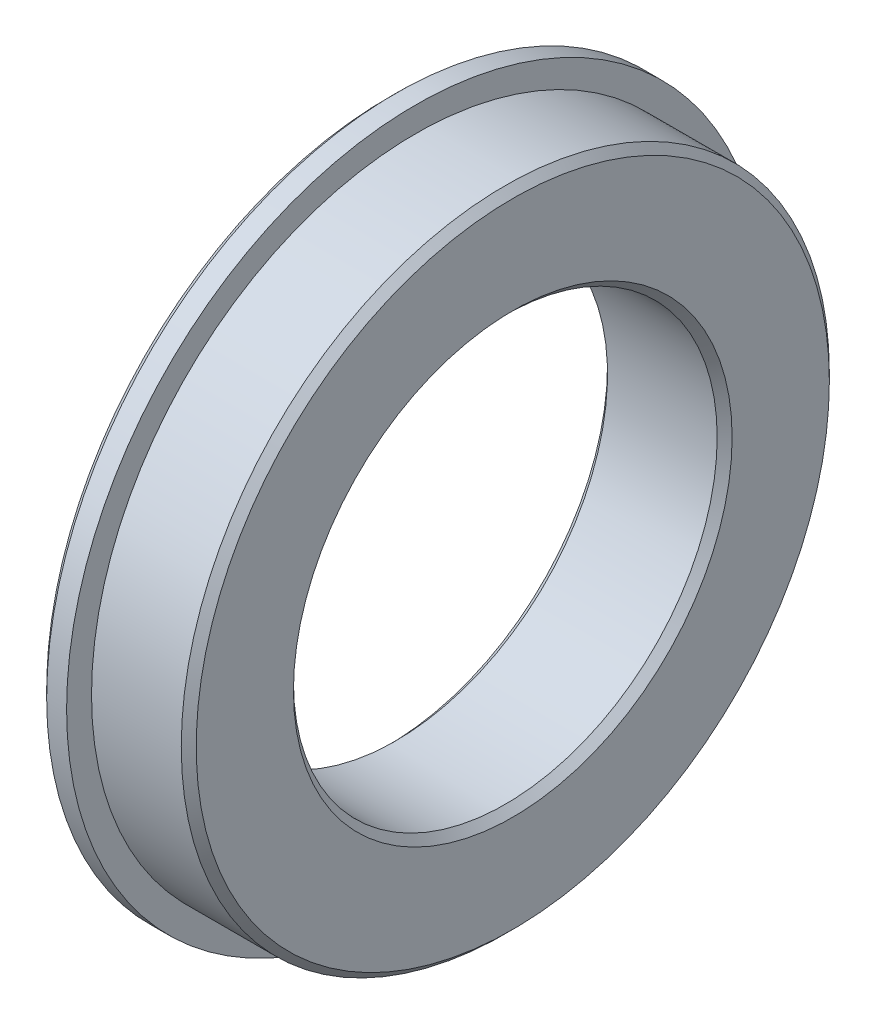
ISO-10303-21;
HEADER;
FILE_DESCRIPTION(('STEP AP214'),'2;1');
FILE_NAME('part.step','',(''),(''),'','','');
FILE_SCHEMA(('AUTOMOTIVE_DESIGN { 1 0 10303 214 1 1 1 1 }'));
ENDSEC;
DATA;
#1=APPLICATION_CONTEXT('core data for automotive mechanical design processes');
#2=APPLICATION_PROTOCOL_DEFINITION('international standard','automotive_design',2000,#1);
#3=PRODUCT_CONTEXT('',#1,'mechanical');
#4=PRODUCT('Part','Part','',(#3));
#5=PRODUCT_RELATED_PRODUCT_CATEGORY('part','',(#4));
#6=PRODUCT_DEFINITION_FORMATION('','',#4);
#7=PRODUCT_DEFINITION_CONTEXT('part definition',#1,'design');
#8=PRODUCT_DEFINITION('design','',#6,#7);
#9=PRODUCT_DEFINITION_SHAPE('','',#8);
#10=(LENGTH_UNIT() NAMED_UNIT(*) SI_UNIT(.MILLI.,.METRE.));
#11=(NAMED_UNIT(*) PLANE_ANGLE_UNIT() SI_UNIT($,.RADIAN.));
#12=(NAMED_UNIT(*) SI_UNIT($,.STERADIAN.) SOLID_ANGLE_UNIT());
#13=UNCERTAINTY_MEASURE_WITH_UNIT(LENGTH_MEASURE(1.E-05),#10,'distance_accuracy_value','');
#14=(GEOMETRIC_REPRESENTATION_CONTEXT(3) GLOBAL_UNCERTAINTY_ASSIGNED_CONTEXT((#13)) GLOBAL_UNIT_ASSIGNED_CONTEXT((#10,
#11,#12)) REPRESENTATION_CONTEXT('',''));
#15=CARTESIAN_POINT('',(0.,0.,0.));
#16=DIRECTION('',(0.,0.,1.));
#17=DIRECTION('',(1.,0.,0.));
#18=AXIS2_PLACEMENT_3D('',#15,#16,#17);
#19=CARTESIAN_POINT('',(5.,0.,0.));
#20=DIRECTION('',(1.,0.,0.));
#21=DIRECTION('',(0.,0.,-1.));
#22=AXIS2_PLACEMENT_3D('',#19,#20,#21);
#23=PLANE('',#22);
#24=CARTESIAN_POINT('',(5.,0.,0.));
#25=DIRECTION('',(1.,0.,0.));
#26=DIRECTION('',(0.,0.,-1.));
#27=AXIS2_PLACEMENT_3D('',#24,#25,#26);
#28=CIRCLE('',#27,12.7);
#29=CARTESIAN_POINT('',(5.,0.,-12.7));
#30=VERTEX_POINT('',#29);
#31=EDGE_CURVE('E63',#30,#30,#28,.T.);
#32=ORIENTED_EDGE('',*,*,#31,.T.);
#33=EDGE_LOOP('',(#32));
#34=FACE_BOUND('',#33,.T.);
#35=CARTESIAN_POINT('',(5.,0.,0.));
#36=DIRECTION('',(1.,0.,0.));
#37=DIRECTION('',(0.,0.,-1.));
#38=AXIS2_PLACEMENT_3D('',#35,#36,#37);
#39=CIRCLE('',#38,8.80000000000001);
#40=CARTESIAN_POINT('',(5.,0.,-8.80000000000001));
#41=VERTEX_POINT('',#40);
#42=EDGE_CURVE('E66',#41,#41,#39,.F.);
#43=ORIENTED_EDGE('',*,*,#42,.T.);
#44=EDGE_LOOP('',(#43));
#45=FACE_BOUND('',#44,.T.);
#46=ADVANCED_FACE('F37',(#34,#45),#23,.T.);
#47=CARTESIAN_POINT('',(5.,0.,0.));
#48=DIRECTION('',(-1.,0.,0.));
#49=DIRECTION('',(0.,0.,1.));
#50=AXIS2_PLACEMENT_3D('',#47,#48,#49);
#51=CYLINDRICAL_SURFACE('',#50,14.);
#52=CARTESIAN_POINT('',(0.299999999999998,0.,0.));
#53=DIRECTION('',(1.,0.,0.));
#54=DIRECTION('',(0.,0.,-1.));
#55=AXIS2_PLACEMENT_3D('',#52,#53,#54);
#56=CIRCLE('',#55,14.);
#57=CARTESIAN_POINT('',(0.299999999999998,0.,-14.));
#58=VERTEX_POINT('',#57);
#59=EDGE_CURVE('E57',#58,#58,#56,.T.);
#60=ORIENTED_EDGE('',*,*,#59,.T.);
#61=EDGE_LOOP('',(#60));
#62=FACE_BOUND('',#61,.T.);
#63=CARTESIAN_POINT('',(1.1,0.,0.));
#64=DIRECTION('',(1.,0.,0.));
#65=DIRECTION('',(0.,0.,-1.));
#66=AXIS2_PLACEMENT_3D('',#63,#64,#65);
#67=CIRCLE('',#66,14.);
#68=CARTESIAN_POINT('',(1.1,0.,-14.));
#69=VERTEX_POINT('',#68);
#70=EDGE_CURVE('E69',#69,#69,#67,.T.);
#71=ORIENTED_EDGE('',*,*,#70,.F.);
#72=EDGE_LOOP('',(#71));
#73=FACE_BOUND('',#72,.T.);
#74=ADVANCED_FACE('F85',(#62,#73),#51,.T.);
#75=CARTESIAN_POINT('',(0.,0.,0.));
#76=DIRECTION('',(1.,0.,0.));
#77=DIRECTION('',(0.,0.,-1.));
#78=AXIS2_PLACEMENT_3D('',#75,#76,#77);
#79=PLANE('',#78);
#80=CARTESIAN_POINT('',(0.,0.,0.));
#81=DIRECTION('',(1.,0.,0.));
#82=DIRECTION('',(0.,0.,-1.));
#83=AXIS2_PLACEMENT_3D('',#80,#81,#82);
#84=CIRCLE('',#83,13.7);
#85=CARTESIAN_POINT('',(0.,0.,-13.7));
#86=VERTEX_POINT('',#85);
#87=EDGE_CURVE('E48',#86,#86,#84,.F.);
#88=ORIENTED_EDGE('',*,*,#87,.T.);
#89=EDGE_LOOP('',(#88));
#90=FACE_BOUND('',#89,.T.);
#91=CARTESIAN_POINT('',(0.,0.,0.));
#92=DIRECTION('',(1.,0.,0.));
#93=DIRECTION('',(0.,0.,-1.));
#94=AXIS2_PLACEMENT_3D('',#91,#92,#93);
#95=CIRCLE('',#94,8.8);
#96=CARTESIAN_POINT('',(0.,0.,8.8));
#97=VERTEX_POINT('',#96);
#98=EDGE_CURVE('E52',#97,#97,#95,.T.);
#99=ORIENTED_EDGE('',*,*,#98,.T.);
#100=EDGE_LOOP('',(#99));
#101=FACE_BOUND('',#100,.T.);
#102=ADVANCED_FACE('F87',(#90,#101),#79,.F.);
#103=CARTESIAN_POINT('',(5.,0.,0.));
#104=DIRECTION('',(-1.,0.,0.));
#105=DIRECTION('',(0.,0.,1.));
#106=AXIS2_PLACEMENT_3D('',#103,#104,#105);
#107=CYLINDRICAL_SURFACE('',#106,8.5);
#108=CARTESIAN_POINT('',(4.69999999999999,0.,0.));
#109=DIRECTION('',(1.,0.,0.));
#110=DIRECTION('',(0.,0.,-1.));
#111=AXIS2_PLACEMENT_3D('',#108,#109,#110);
#112=CIRCLE('',#111,8.5);
#113=CARTESIAN_POINT('',(4.69999999999999,0.,-8.5));
#114=VERTEX_POINT('',#113);
#115=EDGE_CURVE('E10',#114,#114,#112,.T.);
#116=ORIENTED_EDGE('',*,*,#115,.T.);
#117=EDGE_LOOP('',(#116));
#118=FACE_BOUND('',#117,.T.);
#119=CARTESIAN_POINT('',(0.300000000000005,0.,0.));
#120=DIRECTION('',(1.,0.,0.));
#121=DIRECTION('',(0.,0.,-1.));
#122=AXIS2_PLACEMENT_3D('',#119,#120,#121);
#123=CIRCLE('',#122,8.5);
#124=CARTESIAN_POINT('',(0.300000000000005,0.,8.5));
#125=VERTEX_POINT('',#124);
#126=EDGE_CURVE('E44',#125,#125,#123,.F.);
#127=ORIENTED_EDGE('',*,*,#126,.T.);
#128=EDGE_LOOP('',(#127));
#129=FACE_BOUND('',#128,.T.);
#130=ADVANCED_FACE('F81',(#118,#129),#107,.F.);
#131=CARTESIAN_POINT('',(1.1,0.,0.));
#132=DIRECTION('',(1.,0.,0.));
#133=DIRECTION('',(0.,0.,-1.));
#134=AXIS2_PLACEMENT_3D('',#131,#132,#133);
#135=PLANE('',#134);
#136=CARTESIAN_POINT('',(1.1,0.,0.));
#137=DIRECTION('',(1.,0.,0.));
#138=DIRECTION('',(0.,0.,-1.));
#139=AXIS2_PLACEMENT_3D('',#136,#137,#138);
#140=CIRCLE('',#139,13.);
#141=CARTESIAN_POINT('',(1.1,0.,-13.));
#142=VERTEX_POINT('',#141);
#143=EDGE_CURVE('E72',#142,#142,#140,.T.);
#144=ORIENTED_EDGE('',*,*,#143,.F.);
#145=EDGE_LOOP('',(#144));
#146=FACE_BOUND('',#145,.T.);
#147=ORIENTED_EDGE('',*,*,#70,.T.);
#148=EDGE_LOOP('',(#147));
#149=FACE_BOUND('',#148,.T.);
#150=ADVANCED_FACE('F78',(#146,#149),#135,.T.);
#151=CARTESIAN_POINT('',(1.1,0.,0.));
#152=DIRECTION('',(1.,0.,0.));
#153=DIRECTION('',(0.,0.,-1.));
#154=AXIS2_PLACEMENT_3D('',#151,#152,#153);
#155=CYLINDRICAL_SURFACE('',#154,13.);
#156=CARTESIAN_POINT('',(4.69999999999999,0.,0.));
#157=DIRECTION('',(1.,0.,0.));
#158=DIRECTION('',(0.,0.,-1.));
#159=AXIS2_PLACEMENT_3D('',#156,#157,#158);
#160=CIRCLE('',#159,13.);
#161=CARTESIAN_POINT('',(4.69999999999999,0.,-13.));
#162=VERTEX_POINT('',#161);
#163=EDGE_CURVE('E60',#162,#162,#160,.F.);
#164=ORIENTED_EDGE('',*,*,#163,.T.);
#165=EDGE_LOOP('',(#164));
#166=FACE_BOUND('',#165,.T.);
#167=ORIENTED_EDGE('',*,*,#143,.T.);
#168=EDGE_LOOP('',(#167));
#169=FACE_BOUND('',#168,.T.);
#170=ADVANCED_FACE('F76',(#166,#169),#155,.T.);
#171=CARTESIAN_POINT('',(5.,0.,0.));
#172=DIRECTION('',(-1.,0.,0.));
#173=DIRECTION('',(0.,0.,1.));
#174=AXIS2_PLACEMENT_3D('',#171,#172,#173);
#175=CONICAL_SURFACE('',#174,12.7,0.785398163397451);
#176=ORIENTED_EDGE('',*,*,#163,.F.);
#177=EDGE_LOOP('',(#176));
#178=FACE_BOUND('',#177,.T.);
#179=ORIENTED_EDGE('',*,*,#31,.F.);
#180=EDGE_LOOP('',(#179));
#181=FACE_BOUND('',#180,.T.);
#182=ADVANCED_FACE('F99',(#178,#181),#175,.T.);
#183=CARTESIAN_POINT('',(0.299999999999998,0.,0.));
#184=DIRECTION('',(1.,0.,0.));
#185=DIRECTION('',(0.,0.,-1.));
#186=AXIS2_PLACEMENT_3D('',#183,#184,#185);
#187=CONICAL_SURFACE('',#186,14.,0.785398163397451);
#188=ORIENTED_EDGE('',*,*,#87,.F.);
#189=EDGE_LOOP('',(#188));
#190=FACE_BOUND('',#189,.T.);
#191=ORIENTED_EDGE('',*,*,#59,.F.);
#192=EDGE_LOOP('',(#191));
#193=FACE_BOUND('',#192,.T.);
#194=ADVANCED_FACE('F102',(#190,#193),#187,.T.);
#195=CARTESIAN_POINT('',(4.69999999999999,0.,0.));
#196=DIRECTION('',(1.,0.,0.));
#197=DIRECTION('',(0.,0.,-1.));
#198=AXIS2_PLACEMENT_3D('',#195,#196,#197);
#199=CONICAL_SURFACE('',#198,8.5,0.785398163397451);
#200=ORIENTED_EDGE('',*,*,#42,.F.);
#201=EDGE_LOOP('',(#200));
#202=FACE_BOUND('',#201,.T.);
#203=ORIENTED_EDGE('',*,*,#115,.F.);
#204=EDGE_LOOP('',(#203));
#205=FACE_BOUND('',#204,.T.);
#206=ADVANCED_FACE('F105',(#202,#205),#199,.F.);
#207=CARTESIAN_POINT('',(0.,0.,0.));
#208=DIRECTION('',(-1.,0.,0.));
#209=DIRECTION('',(0.,0.,1.));
#210=AXIS2_PLACEMENT_3D('',#207,#208,#209);
#211=CONICAL_SURFACE('',#210,8.8,0.785398163397443);
#212=CARTESIAN_POINT('',(0.300000000000005,0.,8.5));
#213=CARTESIAN_POINT('',(0.296875000000005,0.,8.503125));
#214=CARTESIAN_POINT('',(0.293750000000005,0.,8.50625));
#215=CARTESIAN_POINT('',(0.287500000000005,0.,8.5125));
#216=CARTESIAN_POINT('',(0.284375000000005,0.,8.515625));
#217=CARTESIAN_POINT('',(0.278125000000005,0.,8.521875));
#218=CARTESIAN_POINT('',(0.275000000000005,0.,8.525));
#219=CARTESIAN_POINT('',(0.268750000000005,0.,8.53125));
#220=CARTESIAN_POINT('',(0.265625000000004,0.,8.534375));
#221=CARTESIAN_POINT('',(0.259375000000004,0.,8.540625));
#222=CARTESIAN_POINT('',(0.256250000000004,0.,8.54375));
#223=CARTESIAN_POINT('',(0.250000000000004,0.,8.55));
#224=CARTESIAN_POINT('',(0.246875000000004,0.,8.553125));
#225=CARTESIAN_POINT('',(0.240625000000004,0.,8.559375));
#226=CARTESIAN_POINT('',(0.237500000000004,0.,8.5625));
#227=CARTESIAN_POINT('',(0.231250000000004,0.,8.56875));
#228=CARTESIAN_POINT('',(0.228125000000004,0.,8.571875));
#229=CARTESIAN_POINT('',(0.221875000000004,0.,8.578125));
#230=CARTESIAN_POINT('',(0.218750000000004,0.,8.58125));
#231=CARTESIAN_POINT('',(0.212500000000004,0.,8.5875));
#232=CARTESIAN_POINT('',(0.209375000000003,0.,8.590625));
#233=CARTESIAN_POINT('',(0.203125000000003,0.,8.596875));
#234=CARTESIAN_POINT('',(0.200000000000003,0.,8.6));
#235=CARTESIAN_POINT('',(0.193750000000003,0.,8.60625));
#236=CARTESIAN_POINT('',(0.190625000000003,0.,8.609375));
#237=CARTESIAN_POINT('',(0.184375000000003,0.,8.615625));
#238=CARTESIAN_POINT('',(0.181250000000003,0.,8.61875));
#239=CARTESIAN_POINT('',(0.175000000000003,0.,8.625));
#240=CARTESIAN_POINT('',(0.171875000000003,0.,8.628125));
#241=CARTESIAN_POINT('',(0.165625000000003,0.,8.634375));
#242=CARTESIAN_POINT('',(0.162500000000003,0.,8.6375));
#243=CARTESIAN_POINT('',(0.156250000000002,0.,8.64375));
#244=CARTESIAN_POINT('',(0.153125000000002,0.,8.646875));
#245=CARTESIAN_POINT('',(0.146875000000003,0.,8.653125));
#246=CARTESIAN_POINT('',(0.143750000000003,0.,8.65625));
#247=CARTESIAN_POINT('',(0.137500000000002,0.,8.6625));
#248=CARTESIAN_POINT('',(0.134375000000002,0.,8.665625));
#249=CARTESIAN_POINT('',(0.128125000000002,0.,8.671875));
#250=CARTESIAN_POINT('',(0.125000000000002,0.,8.675));
#251=CARTESIAN_POINT('',(0.118750000000002,0.,8.68125));
#252=CARTESIAN_POINT('',(0.115625000000002,0.,8.684375));
#253=CARTESIAN_POINT('',(0.109375000000002,0.,8.690625));
#254=CARTESIAN_POINT('',(0.106250000000002,0.,8.69375));
#255=CARTESIAN_POINT('',(0.100000000000002,0.,8.7));
#256=CARTESIAN_POINT('',(0.0968750000000018,0.,8.703125));
#257=CARTESIAN_POINT('',(0.0906250000000017,0.,8.709375));
#258=CARTESIAN_POINT('',(0.0875000000000014,0.,8.7125));
#259=CARTESIAN_POINT('',(0.0812500000000012,0.,8.71875));
#260=CARTESIAN_POINT('',(0.0781250000000012,0.,8.721875));
#261=CARTESIAN_POINT('',(0.0718750000000013,0.,8.728125));
#262=CARTESIAN_POINT('',(0.0687500000000014,0.,8.73125));
#263=CARTESIAN_POINT('',(0.0625000000000012,0.,8.7375));
#264=CARTESIAN_POINT('',(0.0593750000000009,0.,8.740625));
#265=CARTESIAN_POINT('',(0.0531250000000007,0.,8.746875));
#266=CARTESIAN_POINT('',(0.0500000000000007,0.,8.75));
#267=CARTESIAN_POINT('',(0.0437500000000008,0.,8.75625));
#268=CARTESIAN_POINT('',(0.0406250000000009,0.,8.759375));
#269=CARTESIAN_POINT('',(0.0343750000000007,0.,8.765625));
#270=CARTESIAN_POINT('',(0.0312500000000004,0.,8.76875));
#271=CARTESIAN_POINT('',(0.0250000000000003,0.,8.775));
#272=CARTESIAN_POINT('',(0.0218750000000005,0.,8.778125));
#273=CARTESIAN_POINT('',(0.0156250000000004,0.,8.784375));
#274=CARTESIAN_POINT('',(0.0125000000000002,0.,8.7875));
#275=CARTESIAN_POINT('',(0.0062499999999998,0.,8.79375));
#276=CARTESIAN_POINT('',(0.00312499999999958,0.,8.796875));
#277=CARTESIAN_POINT('',(0.,0.,8.8));
#278=B_SPLINE_CURVE_WITH_KNOTS('',3,(#212,#213,#214,#215,#216,#217,#218,#219,#220,#221,#222,
#223,#224,#225,#226,#227,#228,#229,#230,#231,#232,#233,#234,#235,#236,#237,#238,#239,#240,#241,
#242,#243,#244,#245,#246,#247,#248,#249,#250,#251,#252,#253,#254,#255,#256,#257,#258,#259,#260,
#261,#262,#263,#264,#265,#266,#267,#268,#269,#270,#271,#272,#273,#274,#275,#276,#277),
.UNSPECIFIED.,.F.,.F.,(4,2,2,2,2,2,2,2,2,2,2,2,2,2,2,2,2,2,2,2,2,2,2,2,2,2,2,2,2,2,2,2,4),(0.,
0.0132582521472484,0.0265165042944955,0.0397747564417439,0.053033008588991,0.0662912607362394,
0.0795495128834878,0.0928077650307349,0.106066017177983,0.119324269325232,0.132582521472479,
0.145840773619727,0.159099025766976,0.172357277914223,0.185615530061471,0.198873782208718,
0.212132034355967,0.225390286503215,0.238648538650462,0.251906790797711,0.265165042944959,
0.278423295092206,0.291681547239454,0.304939799386702,0.31819805153395,0.331456303681198,
0.344714555828446,0.357972807975694,0.371231060122942,0.384489312270189,0.397747564417438,
0.411005816564685,0.424264068711933),.UNSPECIFIED.);
#279=EDGE_CURVE('BSEAM39',#125,#97,#278,.T.);
#280=ORIENTED_EDGE('',*,*,#126,.F.);
#281=ORIENTED_EDGE('',*,*,#98,.F.);
#282=ORIENTED_EDGE('',*,*,#279,.T.);
#283=ORIENTED_EDGE('',*,*,#279,.F.);
#284=EDGE_LOOP('',(#280,#282,#281,#283));
#285=FACE_BOUND('',#284,.T.);
#286=ADVANCED_FACE('F39',(#285),#211,.F.);
#287=CLOSED_SHELL('',(#46,#74,#102,#130,#150,#170,#182,#194,#206,#286));
#288=MANIFOLD_SOLID_BREP('B2',#287);
#289=ADVANCED_BREP_SHAPE_REPRESENTATION('',(#18,#288),#14);
#290=SHAPE_DEFINITION_REPRESENTATION(#9,#289);
ENDSEC;
END-ISO-10303-21;
